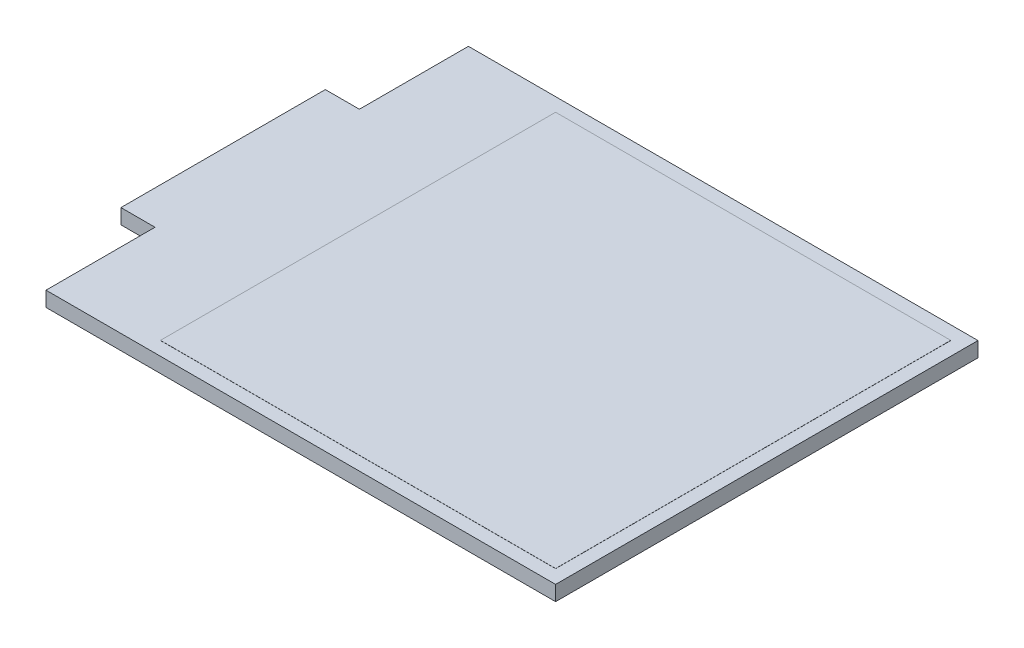
ISO-10303-21;
HEADER;
FILE_DESCRIPTION(('STEP AP214'),'2;1');
FILE_NAME('part.step','',(''),(''),'','','');
FILE_SCHEMA(('AUTOMOTIVE_DESIGN { 1 0 10303 214 1 1 1 1 }'));
ENDSEC;
DATA;
#1=APPLICATION_CONTEXT('core data for automotive mechanical design processes');
#2=APPLICATION_PROTOCOL_DEFINITION('international standard','automotive_design',2000,#1);
#3=PRODUCT_CONTEXT('',#1,'mechanical');
#4=PRODUCT('Part','Part','',(#3));
#5=PRODUCT_RELATED_PRODUCT_CATEGORY('part','',(#4));
#6=PRODUCT_DEFINITION_FORMATION('','',#4);
#7=PRODUCT_DEFINITION_CONTEXT('part definition',#1,'design');
#8=PRODUCT_DEFINITION('design','',#6,#7);
#9=PRODUCT_DEFINITION_SHAPE('','',#8);
#10=(LENGTH_UNIT() NAMED_UNIT(*) SI_UNIT(.MILLI.,.METRE.));
#11=(NAMED_UNIT(*) PLANE_ANGLE_UNIT() SI_UNIT($,.RADIAN.));
#12=(NAMED_UNIT(*) SI_UNIT($,.STERADIAN.) SOLID_ANGLE_UNIT());
#13=UNCERTAINTY_MEASURE_WITH_UNIT(LENGTH_MEASURE(1.E-05),#10,'distance_accuracy_value','');
#14=(GEOMETRIC_REPRESENTATION_CONTEXT(3) GLOBAL_UNCERTAINTY_ASSIGNED_CONTEXT((#13)) GLOBAL_UNIT_ASSIGNED_CONTEXT((#10,
#11,#12)) REPRESENTATION_CONTEXT('',''));
#15=CARTESIAN_POINT('',(0.,0.,0.));
#16=DIRECTION('',(0.,0.,1.));
#17=DIRECTION('',(1.,0.,0.));
#18=AXIS2_PLACEMENT_3D('',#15,#16,#17);
#19=CARTESIAN_POINT('',(-14.5,0.01,14.5));
#20=DIRECTION('',(1.,0.,0.));
#21=DIRECTION('',(0.,0.,-1.));
#22=AXIS2_PLACEMENT_3D('',#19,#20,#21);
#23=PLANE('',#22);
#24=DIRECTION('',(0.,0.,1.));
#25=VECTOR('',#24,1.);
#26=CARTESIAN_POINT('',(-14.5,0.,14.5));
#27=LINE('',#26,#25);
#28=CARTESIAN_POINT('',(-14.5,0.,-14.5));
#29=VERTEX_POINT('',#28);
#30=CARTESIAN_POINT('',(-14.5,0.,14.5));
#31=VERTEX_POINT('',#30);
#32=EDGE_CURVE('E144',#29,#31,#27,.T.);
#33=ORIENTED_EDGE('',*,*,#32,.T.);
#34=DIRECTION('',(0.,-1.,0.));
#35=VECTOR('',#34,1.);
#36=CARTESIAN_POINT('',(-14.5,0.01,14.5));
#37=LINE('',#36,#35);
#38=CARTESIAN_POINT('',(-14.5,0.01,14.5));
#39=VERTEX_POINT('',#38);
#40=EDGE_CURVE('E11',#39,#31,#37,.T.);
#41=ORIENTED_EDGE('',*,*,#40,.F.);
#42=DIRECTION('',(0.,0.,1.));
#43=VECTOR('',#42,1.);
#44=CARTESIAN_POINT('',(-14.5,0.01,14.5));
#45=LINE('',#44,#43);
#46=CARTESIAN_POINT('',(-14.5,0.01,-14.5));
#47=VERTEX_POINT('',#46);
#48=EDGE_CURVE('E153',#47,#39,#45,.T.);
#49=ORIENTED_EDGE('',*,*,#48,.F.);
#50=DIRECTION('',(0.,-1.,0.));
#51=VECTOR('',#50,1.);
#52=CARTESIAN_POINT('',(-14.5,0.01,-14.5));
#53=LINE('',#52,#51);
#54=EDGE_CURVE('E160',#47,#29,#53,.T.);
#55=ORIENTED_EDGE('',*,*,#54,.T.);
#56=EDGE_LOOP('',(#33,#41,#49,#55));
#57=FACE_BOUND('',#56,.T.);
#58=ADVANCED_FACE('F35',(#57),#23,.F.);
#59=CARTESIAN_POINT('',(14.5,0.01,14.5));
#60=DIRECTION('',(0.,0.,-1.));
#61=DIRECTION('',(-1.,0.,0.));
#62=AXIS2_PLACEMENT_3D('',#59,#60,#61);
#63=PLANE('',#62);
#64=DIRECTION('',(1.,0.,0.));
#65=VECTOR('',#64,1.);
#66=CARTESIAN_POINT('',(14.5,0.,14.5));
#67=LINE('',#66,#65);
#68=CARTESIAN_POINT('',(14.5,0.,14.5));
#69=VERTEX_POINT('',#68);
#70=EDGE_CURVE('E147',#31,#69,#67,.T.);
#71=ORIENTED_EDGE('',*,*,#70,.T.);
#72=DIRECTION('',(0.,-1.,0.));
#73=VECTOR('',#72,1.);
#74=CARTESIAN_POINT('',(14.5,0.01,14.5));
#75=LINE('',#74,#73);
#76=CARTESIAN_POINT('',(14.5,0.01,14.5));
#77=VERTEX_POINT('',#76);
#78=EDGE_CURVE('E43',#77,#69,#75,.T.);
#79=ORIENTED_EDGE('',*,*,#78,.F.);
#80=DIRECTION('',(1.,0.,0.));
#81=VECTOR('',#80,1.);
#82=CARTESIAN_POINT('',(14.5,0.01,14.5));
#83=LINE('',#82,#81);
#84=EDGE_CURVE('E155',#39,#77,#83,.T.);
#85=ORIENTED_EDGE('',*,*,#84,.F.);
#86=ORIENTED_EDGE('',*,*,#40,.T.);
#87=EDGE_LOOP('',(#71,#79,#85,#86));
#88=FACE_BOUND('',#87,.T.);
#89=ADVANCED_FACE('F181',(#88),#63,.F.);
#90=CARTESIAN_POINT('',(14.5,0.01,14.5));
#91=DIRECTION('',(-1.,0.,0.));
#92=DIRECTION('',(0.,0.,1.));
#93=AXIS2_PLACEMENT_3D('',#90,#91,#92);
#94=PLANE('',#93);
#95=DIRECTION('',(0.,0.,-1.));
#96=VECTOR('',#95,1.);
#97=CARTESIAN_POINT('',(14.5,0.,14.5));
#98=LINE('',#97,#96);
#99=CARTESIAN_POINT('',(14.5,0.,-14.5));
#100=VERTEX_POINT('',#99);
#101=EDGE_CURVE('E164',#69,#100,#98,.T.);
#102=ORIENTED_EDGE('',*,*,#101,.T.);
#103=DIRECTION('',(0.,-1.,0.));
#104=VECTOR('',#103,1.);
#105=CARTESIAN_POINT('',(14.5,0.01,-14.5));
#106=LINE('',#105,#104);
#107=CARTESIAN_POINT('',(14.5,0.01,-14.5));
#108=VERTEX_POINT('',#107);
#109=EDGE_CURVE('E171',#108,#100,#106,.T.);
#110=ORIENTED_EDGE('',*,*,#109,.F.);
#111=DIRECTION('',(0.,0.,-1.));
#112=VECTOR('',#111,1.);
#113=CARTESIAN_POINT('',(14.5,0.01,14.5));
#114=LINE('',#113,#112);
#115=EDGE_CURVE('E158',#77,#108,#114,.T.);
#116=ORIENTED_EDGE('',*,*,#115,.F.);
#117=ORIENTED_EDGE('',*,*,#78,.T.);
#118=EDGE_LOOP('',(#102,#110,#116,#117));
#119=FACE_BOUND('',#118,.T.);
#120=ADVANCED_FACE('F177',(#119),#94,.F.);
#121=CARTESIAN_POINT('',(14.5,0.01,-14.5));
#122=DIRECTION('',(0.,0.,1.));
#123=DIRECTION('',(1.,0.,0.));
#124=AXIS2_PLACEMENT_3D('',#121,#122,#123);
#125=PLANE('',#124);
#126=DIRECTION('',(-1.,0.,0.));
#127=VECTOR('',#126,1.);
#128=CARTESIAN_POINT('',(14.5,0.,-14.5));
#129=LINE('',#128,#127);
#130=EDGE_CURVE('E156',#100,#29,#129,.T.);
#131=ORIENTED_EDGE('',*,*,#130,.T.);
#132=ORIENTED_EDGE('',*,*,#54,.F.);
#133=DIRECTION('',(-1.,0.,0.));
#134=VECTOR('',#133,1.);
#135=CARTESIAN_POINT('',(14.5,0.01,-14.5));
#136=LINE('',#135,#134);
#137=EDGE_CURVE('E50',#108,#47,#136,.T.);
#138=ORIENTED_EDGE('',*,*,#137,.F.);
#139=ORIENTED_EDGE('',*,*,#109,.T.);
#140=EDGE_LOOP('',(#131,#132,#138,#139));
#141=FACE_BOUND('',#140,.T.);
#142=ADVANCED_FACE('F187',(#141),#125,.F.);
#143=CARTESIAN_POINT('',(0.,0.01,0.));
#144=DIRECTION('',(0.,1.,0.));
#145=DIRECTION('',(0.,0.,1.));
#146=AXIS2_PLACEMENT_3D('',#143,#144,#145);
#147=PLANE('',#146);
#148=ORIENTED_EDGE('',*,*,#48,.T.);
#149=ORIENTED_EDGE('',*,*,#84,.T.);
#150=ORIENTED_EDGE('',*,*,#115,.T.);
#151=ORIENTED_EDGE('',*,*,#137,.T.);
#152=EDGE_LOOP('',(#148,#149,#150,#151));
#153=FACE_BOUND('',#152,.T.);
#154=ADVANCED_FACE('F190',(#153),#147,.T.);
#155=CARTESIAN_POINT('',(15.5,-1.1,15.5));
#156=DIRECTION('',(0.,0.,-1.));
#157=DIRECTION('',(-1.,0.,0.));
#158=AXIS2_PLACEMENT_3D('',#155,#156,#157);
#159=PLANE('',#158);
#160=DIRECTION('',(-1.,0.,0.));
#161=VECTOR('',#160,1.);
#162=CARTESIAN_POINT('',(15.5,0.,15.5));
#163=LINE('',#162,#161);
#164=CARTESIAN_POINT('',(15.5,0.,15.5));
#165=VERTEX_POINT('',#164);
#166=CARTESIAN_POINT('',(-21.9,0.,15.5));
#167=VERTEX_POINT('',#166);
#168=EDGE_CURVE('E143',#165,#167,#163,.T.);
#169=ORIENTED_EDGE('',*,*,#168,.T.);
#170=DIRECTION('',(0.,1.,0.));
#171=VECTOR('',#170,1.);
#172=CARTESIAN_POINT('',(-21.9,-1.1,15.5));
#173=LINE('',#172,#171);
#174=CARTESIAN_POINT('',(-21.9,-1.1,15.5));
#175=VERTEX_POINT('',#174);
#176=EDGE_CURVE('E123',#175,#167,#173,.T.);
#177=ORIENTED_EDGE('',*,*,#176,.F.);
#178=DIRECTION('',(-1.,0.,0.));
#179=VECTOR('',#178,1.);
#180=CARTESIAN_POINT('',(15.5,-1.1,15.5));
#181=LINE('',#180,#179);
#182=CARTESIAN_POINT('',(15.5,-1.1,15.5));
#183=VERTEX_POINT('',#182);
#184=EDGE_CURVE('E130',#183,#175,#181,.T.);
#185=ORIENTED_EDGE('',*,*,#184,.F.);
#186=DIRECTION('',(0.,1.,0.));
#187=VECTOR('',#186,1.);
#188=CARTESIAN_POINT('',(15.5,-1.1,15.5));
#189=LINE('',#188,#187);
#190=EDGE_CURVE('E310',#183,#165,#189,.T.);
#191=ORIENTED_EDGE('',*,*,#190,.T.);
#192=EDGE_LOOP('',(#169,#177,#185,#191));
#193=FACE_BOUND('',#192,.T.);
#194=ADVANCED_FACE('F141',(#193),#159,.F.);
#195=CARTESIAN_POINT('',(-21.9,-1.1,15.5));
#196=DIRECTION('',(1.,0.,0.));
#197=DIRECTION('',(0.,0.,-1.));
#198=AXIS2_PLACEMENT_3D('',#195,#196,#197);
#199=PLANE('',#198);
#200=DIRECTION('',(0.,0.,-1.));
#201=VECTOR('',#200,1.);
#202=CARTESIAN_POINT('',(-21.9,0.,15.5));
#203=LINE('',#202,#201);
#204=CARTESIAN_POINT('',(-21.9,0.,7.5));
#205=VERTEX_POINT('',#204);
#206=EDGE_CURVE('E318',#167,#205,#203,.T.);
#207=ORIENTED_EDGE('',*,*,#206,.T.);
#208=DIRECTION('',(0.,1.,0.));
#209=VECTOR('',#208,1.);
#210=CARTESIAN_POINT('',(-21.9,-1.1,7.5));
#211=LINE('',#210,#209);
#212=CARTESIAN_POINT('',(-21.9,-1.1,7.5));
#213=VERTEX_POINT('',#212);
#214=EDGE_CURVE('E126',#213,#205,#211,.T.);
#215=ORIENTED_EDGE('',*,*,#214,.F.);
#216=DIRECTION('',(0.,0.,-1.));
#217=VECTOR('',#216,1.);
#218=CARTESIAN_POINT('',(-21.9,-1.1,15.5));
#219=LINE('',#218,#217);
#220=EDGE_CURVE('E119',#175,#213,#219,.T.);
#221=ORIENTED_EDGE('',*,*,#220,.F.);
#222=ORIENTED_EDGE('',*,*,#176,.T.);
#223=EDGE_LOOP('',(#207,#215,#221,#222));
#224=FACE_BOUND('',#223,.T.);
#225=ADVANCED_FACE('F121',(#224),#199,.F.);
#226=CARTESIAN_POINT('',(-21.9,-1.1,7.5));
#227=DIRECTION('',(0.,0.,-1.));
#228=DIRECTION('',(-1.,0.,0.));
#229=AXIS2_PLACEMENT_3D('',#226,#227,#228);
#230=PLANE('',#229);
#231=DIRECTION('',(-1.,0.,0.));
#232=VECTOR('',#231,1.);
#233=CARTESIAN_POINT('',(-21.9,0.,7.5));
#234=LINE('',#233,#232);
#235=CARTESIAN_POINT('',(-24.4,0.,7.5));
#236=VERTEX_POINT('',#235);
#237=EDGE_CURVE('E320',#205,#236,#234,.T.);
#238=ORIENTED_EDGE('',*,*,#237,.T.);
#239=DIRECTION('',(0.,1.,0.));
#240=VECTOR('',#239,1.);
#241=CARTESIAN_POINT('',(-24.4,-1.1,7.5));
#242=LINE('',#241,#240);
#243=CARTESIAN_POINT('',(-24.4,-1.1,7.5));
#244=VERTEX_POINT('',#243);
#245=EDGE_CURVE('E149',#244,#236,#242,.T.);
#246=ORIENTED_EDGE('',*,*,#245,.F.);
#247=DIRECTION('',(-1.,0.,0.));
#248=VECTOR('',#247,1.);
#249=CARTESIAN_POINT('',(-21.9,-1.1,7.5));
#250=LINE('',#249,#248);
#251=EDGE_CURVE('E129',#213,#244,#250,.T.);
#252=ORIENTED_EDGE('',*,*,#251,.F.);
#253=ORIENTED_EDGE('',*,*,#214,.T.);
#254=EDGE_LOOP('',(#238,#246,#252,#253));
#255=FACE_BOUND('',#254,.T.);
#256=ADVANCED_FACE('F229',(#255),#230,.F.);
#257=CARTESIAN_POINT('',(-24.4,-1.1,7.5));
#258=DIRECTION('',(1.,0.,0.));
#259=DIRECTION('',(0.,0.,-1.));
#260=AXIS2_PLACEMENT_3D('',#257,#258,#259);
#261=PLANE('',#260);
#262=DIRECTION('',(0.,0.,-1.));
#263=VECTOR('',#262,1.);
#264=CARTESIAN_POINT('',(-24.4,0.,7.5));
#265=LINE('',#264,#263);
#266=CARTESIAN_POINT('',(-24.4,0.,-7.5));
#267=VERTEX_POINT('',#266);
#268=EDGE_CURVE('E326',#236,#267,#265,.T.);
#269=ORIENTED_EDGE('',*,*,#268,.T.);
#270=DIRECTION('',(0.,1.,0.));
#271=VECTOR('',#270,1.);
#272=CARTESIAN_POINT('',(-24.4,-1.1,-7.5));
#273=LINE('',#272,#271);
#274=CARTESIAN_POINT('',(-24.4,-1.1,-7.5));
#275=VERTEX_POINT('',#274);
#276=EDGE_CURVE('E340',#275,#267,#273,.T.);
#277=ORIENTED_EDGE('',*,*,#276,.F.);
#278=DIRECTION('',(0.,0.,-1.));
#279=VECTOR('',#278,1.);
#280=CARTESIAN_POINT('',(-24.4,-1.1,7.5));
#281=LINE('',#280,#279);
#282=EDGE_CURVE('E347',#244,#275,#281,.T.);
#283=ORIENTED_EDGE('',*,*,#282,.F.);
#284=ORIENTED_EDGE('',*,*,#245,.T.);
#285=EDGE_LOOP('',(#269,#277,#283,#284));
#286=FACE_BOUND('',#285,.T.);
#287=ADVANCED_FACE('F238',(#286),#261,.F.);
#288=CARTESIAN_POINT('',(-24.4,-1.1,-7.5));
#289=DIRECTION('',(0.,0.,1.));
#290=DIRECTION('',(1.,0.,0.));
#291=AXIS2_PLACEMENT_3D('',#288,#289,#290);
#292=PLANE('',#291);
#293=DIRECTION('',(1.,0.,0.));
#294=VECTOR('',#293,1.);
#295=CARTESIAN_POINT('',(-24.4,0.,-7.5));
#296=LINE('',#295,#294);
#297=CARTESIAN_POINT('',(-21.9,0.,-7.5));
#298=VERTEX_POINT('',#297);
#299=EDGE_CURVE('E328',#267,#298,#296,.T.);
#300=ORIENTED_EDGE('',*,*,#299,.T.);
#301=DIRECTION('',(0.,1.,0.));
#302=VECTOR('',#301,1.);
#303=CARTESIAN_POINT('',(-21.9,-1.1,-7.5));
#304=LINE('',#303,#302);
#305=CARTESIAN_POINT('',(-21.9,-1.1,-7.5));
#306=VERTEX_POINT('',#305);
#307=EDGE_CURVE('E337',#306,#298,#304,.T.);
#308=ORIENTED_EDGE('',*,*,#307,.F.);
#309=DIRECTION('',(1.,0.,0.));
#310=VECTOR('',#309,1.);
#311=CARTESIAN_POINT('',(-24.4,-1.1,-7.5));
#312=LINE('',#311,#310);
#313=EDGE_CURVE('E357',#275,#306,#312,.T.);
#314=ORIENTED_EDGE('',*,*,#313,.F.);
#315=ORIENTED_EDGE('',*,*,#276,.T.);
#316=EDGE_LOOP('',(#300,#308,#314,#315));
#317=FACE_BOUND('',#316,.T.);
#318=ADVANCED_FACE('F248',(#317),#292,.F.);
#319=CARTESIAN_POINT('',(-21.9,-1.1,-7.5));
#320=DIRECTION('',(1.,0.,0.));
#321=DIRECTION('',(0.,0.,-1.));
#322=AXIS2_PLACEMENT_3D('',#319,#320,#321);
#323=PLANE('',#322);
#324=DIRECTION('',(0.,0.,-1.));
#325=VECTOR('',#324,1.);
#326=CARTESIAN_POINT('',(-21.9,0.,-7.5));
#327=LINE('',#326,#325);
#328=CARTESIAN_POINT('',(-21.9,0.,-15.5));
#329=VERTEX_POINT('',#328);
#330=EDGE_CURVE('E330',#298,#329,#327,.T.);
#331=ORIENTED_EDGE('',*,*,#330,.T.);
#332=DIRECTION('',(0.,1.,0.));
#333=VECTOR('',#332,1.);
#334=CARTESIAN_POINT('',(-21.9,-1.1,-15.5));
#335=LINE('',#334,#333);
#336=CARTESIAN_POINT('',(-21.9,-1.1,-15.5));
#337=VERTEX_POINT('',#336);
#338=EDGE_CURVE('E334',#337,#329,#335,.T.);
#339=ORIENTED_EDGE('',*,*,#338,.F.);
#340=DIRECTION('',(0.,0.,-1.));
#341=VECTOR('',#340,1.);
#342=CARTESIAN_POINT('',(-21.9,-1.1,-7.5));
#343=LINE('',#342,#341);
#344=EDGE_CURVE('E354',#306,#337,#343,.T.);
#345=ORIENTED_EDGE('',*,*,#344,.F.);
#346=ORIENTED_EDGE('',*,*,#307,.T.);
#347=EDGE_LOOP('',(#331,#339,#345,#346));
#348=FACE_BOUND('',#347,.T.);
#349=ADVANCED_FACE('F258',(#348),#323,.F.);
#350=CARTESIAN_POINT('',(-21.9,-1.1,-15.5));
#351=DIRECTION('',(0.,0.,1.));
#352=DIRECTION('',(1.,0.,0.));
#353=AXIS2_PLACEMENT_3D('',#350,#351,#352);
#354=PLANE('',#353);
#355=DIRECTION('',(1.,0.,0.));
#356=VECTOR('',#355,1.);
#357=CARTESIAN_POINT('',(-21.9,0.,-15.5));
#358=LINE('',#357,#356);
#359=CARTESIAN_POINT('',(15.5,0.,-15.5));
#360=VERTEX_POINT('',#359);
#361=EDGE_CURVE('E314',#329,#360,#358,.T.);
#362=ORIENTED_EDGE('',*,*,#361,.T.);
#363=DIRECTION('',(0.,1.,0.));
#364=VECTOR('',#363,1.);
#365=CARTESIAN_POINT('',(15.5,-1.1,-15.5));
#366=LINE('',#365,#364);
#367=CARTESIAN_POINT('',(15.5,-1.1,-15.5));
#368=VERTEX_POINT('',#367);
#369=EDGE_CURVE('E312',#368,#360,#366,.T.);
#370=ORIENTED_EDGE('',*,*,#369,.F.);
#371=DIRECTION('',(1.,0.,0.));
#372=VECTOR('',#371,1.);
#373=CARTESIAN_POINT('',(-21.9,-1.1,-15.5));
#374=LINE('',#373,#372);
#375=EDGE_CURVE('E356',#337,#368,#374,.T.);
#376=ORIENTED_EDGE('',*,*,#375,.F.);
#377=ORIENTED_EDGE('',*,*,#338,.T.);
#378=EDGE_LOOP('',(#362,#370,#376,#377));
#379=FACE_BOUND('',#378,.T.);
#380=ADVANCED_FACE('F268',(#379),#354,.F.);
#381=CARTESIAN_POINT('',(15.5,-1.1,-15.5));
#382=DIRECTION('',(-1.,0.,0.));
#383=DIRECTION('',(0.,0.,1.));
#384=AXIS2_PLACEMENT_3D('',#381,#382,#383);
#385=PLANE('',#384);
#386=DIRECTION('',(0.,0.,1.));
#387=VECTOR('',#386,1.);
#388=CARTESIAN_POINT('',(15.5,0.,-15.5));
#389=LINE('',#388,#387);
#390=EDGE_CURVE('E139',#360,#165,#389,.T.);
#391=ORIENTED_EDGE('',*,*,#390,.T.);
#392=ORIENTED_EDGE('',*,*,#190,.F.);
#393=DIRECTION('',(0.,0.,1.));
#394=VECTOR('',#393,1.);
#395=CARTESIAN_POINT('',(15.5,-1.1,-15.5));
#396=LINE('',#395,#394);
#397=EDGE_CURVE('E135',#368,#183,#396,.T.);
#398=ORIENTED_EDGE('',*,*,#397,.F.);
#399=ORIENTED_EDGE('',*,*,#369,.T.);
#400=EDGE_LOOP('',(#391,#392,#398,#399));
#401=FACE_BOUND('',#400,.T.);
#402=ADVANCED_FACE('F278',(#401),#385,.F.);
#403=CARTESIAN_POINT('',(0.,-1.1,0.));
#404=DIRECTION('',(0.,-1.,0.));
#405=DIRECTION('',(0.,0.,-1.));
#406=AXIS2_PLACEMENT_3D('',#403,#404,#405);
#407=PLANE('',#406);
#408=ORIENTED_EDGE('',*,*,#184,.T.);
#409=ORIENTED_EDGE('',*,*,#220,.T.);
#410=ORIENTED_EDGE('',*,*,#251,.T.);
#411=ORIENTED_EDGE('',*,*,#282,.T.);
#412=ORIENTED_EDGE('',*,*,#313,.T.);
#413=ORIENTED_EDGE('',*,*,#344,.T.);
#414=ORIENTED_EDGE('',*,*,#375,.T.);
#415=ORIENTED_EDGE('',*,*,#397,.T.);
#416=EDGE_LOOP('',(#408,#409,#410,#411,#412,#413,#414,#415));
#417=FACE_BOUND('',#416,.T.);
#418=ADVANCED_FACE('F133',(#417),#407,.T.);
#419=CARTESIAN_POINT('',(0.,0.,0.));
#420=DIRECTION('',(0.,-1.,0.));
#421=DIRECTION('',(0.,0.,-1.));
#422=AXIS2_PLACEMENT_3D('',#419,#420,#421);
#423=PLANE('',#422);
#424=ORIENTED_EDGE('',*,*,#32,.F.);
#425=ORIENTED_EDGE('',*,*,#130,.F.);
#426=ORIENTED_EDGE('',*,*,#101,.F.);
#427=ORIENTED_EDGE('',*,*,#70,.F.);
#428=EDGE_LOOP('',(#424,#425,#426,#427));
#429=FACE_BOUND('',#428,.T.);
#430=ORIENTED_EDGE('',*,*,#168,.F.);
#431=ORIENTED_EDGE('',*,*,#390,.F.);
#432=ORIENTED_EDGE('',*,*,#361,.F.);
#433=ORIENTED_EDGE('',*,*,#330,.F.);
#434=ORIENTED_EDGE('',*,*,#299,.F.);
#435=ORIENTED_EDGE('',*,*,#268,.F.);
#436=ORIENTED_EDGE('',*,*,#237,.F.);
#437=ORIENTED_EDGE('',*,*,#206,.F.);
#438=EDGE_LOOP('',(#430,#431,#432,#433,#434,#435,#436,#437));
#439=FACE_BOUND('',#438,.T.);
#440=ADVANCED_FACE('F184',(#429,#439),#423,.F.);
#441=CLOSED_SHELL('',(#58,#89,#120,#142,#154,#194,#225,#256,#287,#318,#349,#380,#402,#418,#440));
#442=MANIFOLD_SOLID_BREP('B2',#441);
#443=ADVANCED_BREP_SHAPE_REPRESENTATION('',(#18,#442),#14);
#444=SHAPE_DEFINITION_REPRESENTATION(#9,#443);
ENDSEC;
END-ISO-10303-21;
